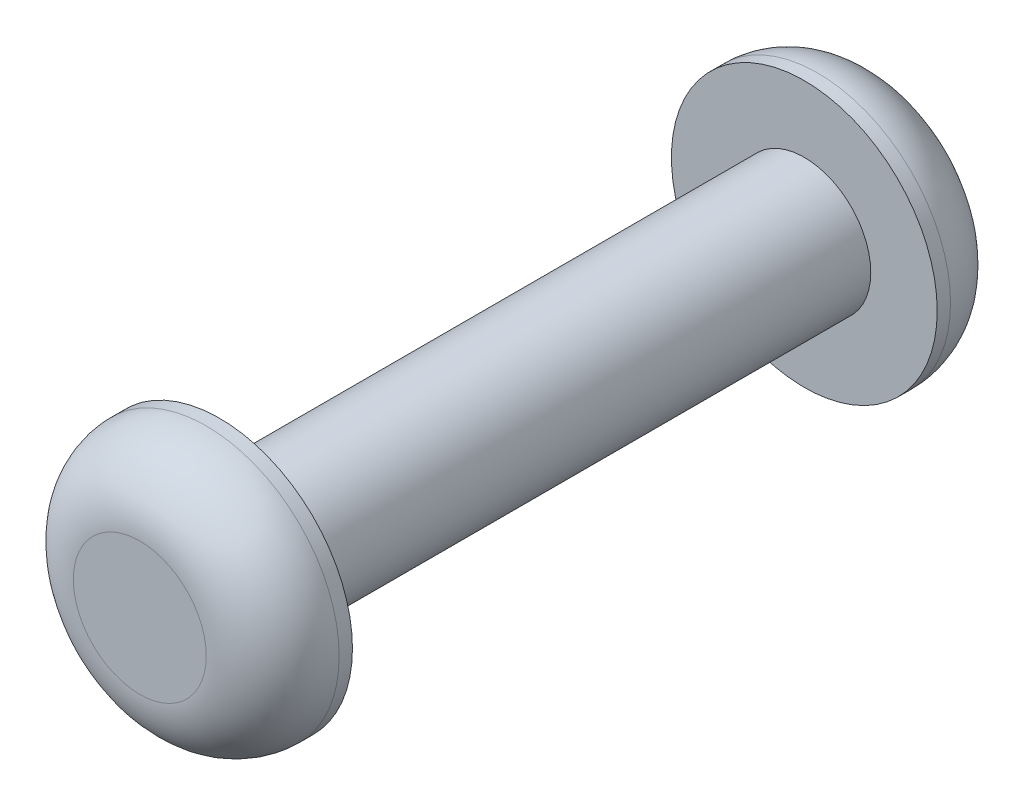
ISO-10303-21;
HEADER;
FILE_DESCRIPTION(('STEP AP214'),'2;1');
FILE_NAME('part.step','',(''),(''),'','','');
FILE_SCHEMA(('AUTOMOTIVE_DESIGN { 1 0 10303 214 1 1 1 1 }'));
ENDSEC;
DATA;
#1=APPLICATION_CONTEXT('core data for automotive mechanical design processes');
#2=APPLICATION_PROTOCOL_DEFINITION('international standard','automotive_design',2000,#1);
#3=PRODUCT_CONTEXT('',#1,'mechanical');
#4=PRODUCT('Part','Part','',(#3));
#5=PRODUCT_RELATED_PRODUCT_CATEGORY('part','',(#4));
#6=PRODUCT_DEFINITION_FORMATION('','',#4);
#7=PRODUCT_DEFINITION_CONTEXT('part definition',#1,'design');
#8=PRODUCT_DEFINITION('design','',#6,#7);
#9=PRODUCT_DEFINITION_SHAPE('','',#8);
#10=(LENGTH_UNIT() NAMED_UNIT(*) SI_UNIT(.MILLI.,.METRE.));
#11=(NAMED_UNIT(*) PLANE_ANGLE_UNIT() SI_UNIT($,.RADIAN.));
#12=(NAMED_UNIT(*) SI_UNIT($,.STERADIAN.) SOLID_ANGLE_UNIT());
#13=UNCERTAINTY_MEASURE_WITH_UNIT(LENGTH_MEASURE(1.E-05),#10,'distance_accuracy_value','');
#14=(GEOMETRIC_REPRESENTATION_CONTEXT(3) GLOBAL_UNCERTAINTY_ASSIGNED_CONTEXT((#13)) GLOBAL_UNIT_ASSIGNED_CONTEXT((#10,
#11,#12)) REPRESENTATION_CONTEXT('',''));
#15=CARTESIAN_POINT('',(0.,0.,0.));
#16=DIRECTION('',(0.,0.,1.));
#17=DIRECTION('',(1.,0.,0.));
#18=AXIS2_PLACEMENT_3D('',#15,#16,#17);
#19=CARTESIAN_POINT('',(135.411081039254,-23.8747718194606,11.5000090062341));
#20=DIRECTION('',(0.,0.,-1.));
#21=DIRECTION('',(-1.,0.,0.));
#22=AXIS2_PLACEMENT_3D('',#19,#20,#21);
#23=DEGENERATE_TOROIDAL_SURFACE('',#22,2.5,2.5,.T.);
#24=CARTESIAN_POINT('',(135.411081039254,-23.8747718194607,14.0000090062341));
#25=DIRECTION('',(0.,0.,-1.));
#26=DIRECTION('',(-1.,0.,0.));
#27=AXIS2_PLACEMENT_3D('',#24,#25,#26);
#28=CIRCLE('',#27,2.5);
#29=CARTESIAN_POINT('',(137.911081039254,-23.8747718194607,14.0000090062339));
#30=VERTEX_POINT('',#29);
#31=EDGE_CURVE('E10',#30,#30,#28,.T.);
#32=ORIENTED_EDGE('',*,*,#31,.T.);
#33=EDGE_LOOP('',(#32));
#34=FACE_BOUND('',#33,.T.);
#35=CARTESIAN_POINT('',(135.411081039254,-23.8747718194606,11.5000090062341));
#36=DIRECTION('',(0.,0.,1.));
#37=DIRECTION('',(-1.,0.,0.));
#38=AXIS2_PLACEMENT_3D('',#35,#36,#37);
#39=CIRCLE('',#38,5.);
#40=CARTESIAN_POINT('',(140.411081039254,-23.8747718194606,11.5000090062338));
#41=VERTEX_POINT('',#40);
#42=EDGE_CURVE('E27',#41,#41,#39,.T.);
#43=ORIENTED_EDGE('',*,*,#42,.T.);
#44=EDGE_LOOP('',(#43));
#45=FACE_BOUND('',#44,.T.);
#46=ADVANCED_FACE('F16',(#34,#45),#23,.T.);
#47=CARTESIAN_POINT('',(1.32649613447282,-1.00323600575997,14.0000090062457));
#48=DIRECTION('',(0.,0.,-1.));
#49=DIRECTION('',(-0.991403766618878,0.130837959071143,0.));
#50=AXIS2_PLACEMENT_3D('',#47,#48,#49);
#51=PLANE('',#50);
#52=ORIENTED_EDGE('',*,*,#31,.F.);
#53=EDGE_LOOP('',(#52));
#54=FACE_BOUND('',#53,.T.);
#55=ADVANCED_FACE('F99',(#54),#51,.F.);
#56=CARTESIAN_POINT('',(135.411081039252,-23.874771819459,-10.9999909937659));
#57=DIRECTION('',(0.,0.,1.));
#58=DIRECTION('',(-1.,0.,0.));
#59=AXIS2_PLACEMENT_3D('',#56,#57,#58);
#60=CYLINDRICAL_SURFACE('',#59,5.);
#61=CARTESIAN_POINT('',(135.411081039254,-23.8747718194605,11.0000090062341));
#62=DIRECTION('',(0.,0.,-1.));
#63=DIRECTION('',(-1.,0.,0.));
#64=AXIS2_PLACEMENT_3D('',#61,#62,#63);
#65=CIRCLE('',#64,5.);
#66=CARTESIAN_POINT('',(140.411081039254,-23.8747718194605,11.0000090062338));
#67=VERTEX_POINT('',#66);
#68=EDGE_CURVE('E54',#67,#67,#65,.T.);
#69=ORIENTED_EDGE('',*,*,#68,.F.);
#70=EDGE_LOOP('',(#69));
#71=FACE_BOUND('',#70,.T.);
#72=ORIENTED_EDGE('',*,*,#42,.F.);
#73=EDGE_LOOP('',(#72));
#74=FACE_BOUND('',#73,.T.);
#75=ADVANCED_FACE('F105',(#71,#74),#60,.T.);
#76=CARTESIAN_POINT('',(135.411081039252,-23.8747718194589,-11.4999909937659));
#77=DIRECTION('',(0.,0.,1.));
#78=DIRECTION('',(1.,0.,0.));
#79=AXIS2_PLACEMENT_3D('',#76,#77,#78);
#80=DEGENERATE_TOROIDAL_SURFACE('',#79,2.5,2.5,.T.);
#81=CARTESIAN_POINT('',(135.411081039252,-23.8747718194588,-13.9999909937659));
#82=DIRECTION('',(0.,0.,1.));
#83=DIRECTION('',(-1.,0.,0.));
#84=AXIS2_PLACEMENT_3D('',#81,#82,#83);
#85=CIRCLE('',#84,2.5);
#86=CARTESIAN_POINT('',(137.911081039252,-23.8747718194588,-13.9999909937661));
#87=VERTEX_POINT('',#86);
#88=EDGE_CURVE('E67',#87,#87,#85,.T.);
#89=ORIENTED_EDGE('',*,*,#88,.T.);
#90=EDGE_LOOP('',(#89));
#91=FACE_BOUND('',#90,.T.);
#92=CARTESIAN_POINT('',(135.411081039252,-23.8747718194589,-11.4999909937659));
#93=DIRECTION('',(0.,0.,-1.));
#94=DIRECTION('',(-1.,0.,0.));
#95=AXIS2_PLACEMENT_3D('',#92,#93,#94);
#96=CIRCLE('',#95,5.);
#97=CARTESIAN_POINT('',(140.411081039252,-23.8747718194589,-11.4999909937662));
#98=VERTEX_POINT('',#97);
#99=EDGE_CURVE('E63',#98,#98,#96,.T.);
#100=ORIENTED_EDGE('',*,*,#99,.T.);
#101=EDGE_LOOP('',(#100));
#102=FACE_BOUND('',#101,.T.);
#103=ADVANCED_FACE('F79',(#91,#102),#80,.T.);
#104=CARTESIAN_POINT('',(1.32649613447074,-1.003236005758,-13.9999909937543));
#105=DIRECTION('',(0.,0.,-1.));
#106=DIRECTION('',(-0.991403766618878,0.130837959071143,0.));
#107=AXIS2_PLACEMENT_3D('',#104,#105,#106);
#108=PLANE('',#107);
#109=ORIENTED_EDGE('',*,*,#88,.F.);
#110=EDGE_LOOP('',(#109));
#111=FACE_BOUND('',#110,.T.);
#112=ADVANCED_FACE('F84',(#111),#108,.T.);
#113=CARTESIAN_POINT('',(135.411081039252,-23.874771819459,-10.9999909937659));
#114=DIRECTION('',(0.,0.,1.));
#115=DIRECTION('',(-1.,0.,0.));
#116=AXIS2_PLACEMENT_3D('',#113,#114,#115);
#117=CYLINDRICAL_SURFACE('',#116,5.);
#118=CARTESIAN_POINT('',(135.411081039252,-23.874771819459,-10.9999909937659));
#119=DIRECTION('',(0.,0.,1.));
#120=DIRECTION('',(-1.,0.,0.));
#121=AXIS2_PLACEMENT_3D('',#118,#119,#120);
#122=CIRCLE('',#121,5.);
#123=CARTESIAN_POINT('',(140.411081039252,-23.874771819459,-10.9999909937663));
#124=VERTEX_POINT('',#123);
#125=EDGE_CURVE('E20',#124,#124,#122,.T.);
#126=ORIENTED_EDGE('',*,*,#125,.F.);
#127=EDGE_LOOP('',(#126));
#128=FACE_BOUND('',#127,.T.);
#129=ORIENTED_EDGE('',*,*,#99,.F.);
#130=EDGE_LOOP('',(#129));
#131=FACE_BOUND('',#130,.T.);
#132=ADVANCED_FACE('F81',(#128,#131),#117,.T.);
#133=CARTESIAN_POINT('',(132.911081039254,-23.8747718194605,11.0000090062343));
#134=DIRECTION('',(0.,0.,-1.));
#135=DIRECTION('',(-1.,0.,0.));
#136=AXIS2_PLACEMENT_3D('',#133,#134,#135);
#137=PLANE('',#136);
#138=ORIENTED_EDGE('',*,*,#68,.T.);
#139=EDGE_LOOP('',(#138));
#140=FACE_BOUND('',#139,.T.);
#141=CARTESIAN_POINT('',(135.411081039254,-23.8747718194605,11.0000090062341));
#142=DIRECTION('',(0.,0.,-1.));
#143=DIRECTION('',(-1.,0.,0.));
#144=AXIS2_PLACEMENT_3D('',#141,#142,#143);
#145=CIRCLE('',#144,2.5);
#146=CARTESIAN_POINT('',(137.911081039254,-23.8747718194605,11.0000090062339));
#147=VERTEX_POINT('',#146);
#148=EDGE_CURVE('E55',#147,#147,#145,.T.);
#149=ORIENTED_EDGE('',*,*,#148,.F.);
#150=EDGE_LOOP('',(#149));
#151=FACE_BOUND('',#150,.T.);
#152=ADVANCED_FACE('F83',(#140,#151),#137,.T.);
#153=CARTESIAN_POINT('',(135.411081039252,-23.874771819459,-10.9999909937659));
#154=DIRECTION('',(0.,0.,1.));
#155=DIRECTION('',(-1.,0.,0.));
#156=AXIS2_PLACEMENT_3D('',#153,#154,#155);
#157=CYLINDRICAL_SURFACE('',#156,2.5);
#158=CARTESIAN_POINT('',(135.411081039252,-23.874771819459,-10.9999909937659));
#159=DIRECTION('',(0.,0.,1.));
#160=DIRECTION('',(-1.,0.,0.));
#161=AXIS2_PLACEMENT_3D('',#158,#159,#160);
#162=CIRCLE('',#161,2.5);
#163=CARTESIAN_POINT('',(137.911081039252,-23.874771819459,-10.9999909937661));
#164=VERTEX_POINT('',#163);
#165=EDGE_CURVE('E51',#164,#164,#162,.T.);
#166=ORIENTED_EDGE('',*,*,#165,.T.);
#167=EDGE_LOOP('',(#166));
#168=FACE_BOUND('',#167,.T.);
#169=ORIENTED_EDGE('',*,*,#148,.T.);
#170=EDGE_LOOP('',(#169));
#171=FACE_BOUND('',#170,.T.);
#172=ADVANCED_FACE('F92',(#168,#171),#157,.T.);
#173=CARTESIAN_POINT('',(132.911081039252,-23.874771819459,-10.9999909937657));
#174=DIRECTION('',(0.,0.,1.));
#175=DIRECTION('',(1.,0.,0.));
#176=AXIS2_PLACEMENT_3D('',#173,#174,#175);
#177=PLANE('',#176);
#178=ORIENTED_EDGE('',*,*,#125,.T.);
#179=EDGE_LOOP('',(#178));
#180=FACE_BOUND('',#179,.T.);
#181=ORIENTED_EDGE('',*,*,#165,.F.);
#182=EDGE_LOOP('',(#181));
#183=FACE_BOUND('',#182,.T.);
#184=ADVANCED_FACE('F18',(#180,#183),#177,.T.);
#185=CLOSED_SHELL('',(#46,#55,#75,#103,#112,#132,#152,#172,#184));
#186=MANIFOLD_SOLID_BREP('B1',#185);
#187=ADVANCED_BREP_SHAPE_REPRESENTATION('',(#18,#186),#14);
#188=SHAPE_DEFINITION_REPRESENTATION(#9,#187);
ENDSEC;
END-ISO-10303-21;
